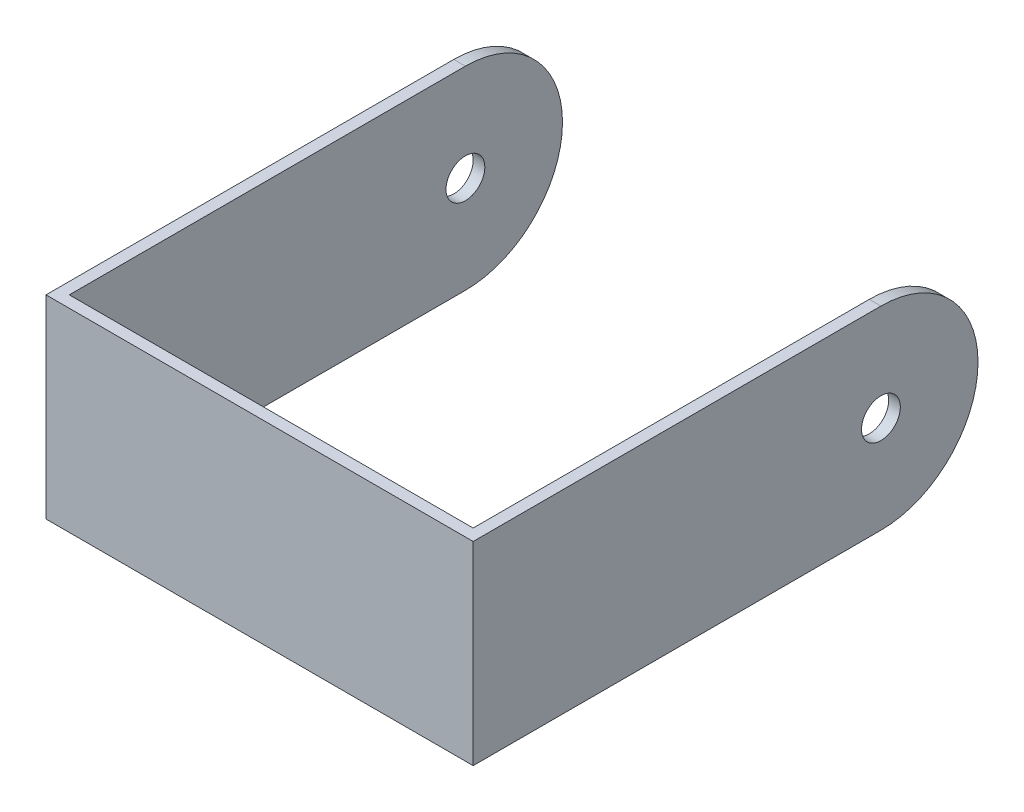
ISO-10303-21;
HEADER;
FILE_DESCRIPTION(('STEP AP214'),'2;1');
FILE_NAME('part.step','',(''),(''),'','','');
FILE_SCHEMA(('AUTOMOTIVE_DESIGN { 1 0 10303 214 1 1 1 1 }'));
ENDSEC;
DATA;
#1=APPLICATION_CONTEXT('core data for automotive mechanical design processes');
#2=APPLICATION_PROTOCOL_DEFINITION('international standard','automotive_design',2000,#1);
#3=PRODUCT_CONTEXT('',#1,'mechanical');
#4=PRODUCT('Part','Part','',(#3));
#5=PRODUCT_RELATED_PRODUCT_CATEGORY('part','',(#4));
#6=PRODUCT_DEFINITION_FORMATION('','',#4);
#7=PRODUCT_DEFINITION_CONTEXT('part definition',#1,'design');
#8=PRODUCT_DEFINITION('design','',#6,#7);
#9=PRODUCT_DEFINITION_SHAPE('','',#8);
#10=(LENGTH_UNIT() NAMED_UNIT(*) SI_UNIT(.MILLI.,.METRE.));
#11=(NAMED_UNIT(*) PLANE_ANGLE_UNIT() SI_UNIT($,.RADIAN.));
#12=(NAMED_UNIT(*) SI_UNIT($,.STERADIAN.) SOLID_ANGLE_UNIT());
#13=UNCERTAINTY_MEASURE_WITH_UNIT(LENGTH_MEASURE(1.E-05),#10,'distance_accuracy_value','');
#14=(GEOMETRIC_REPRESENTATION_CONTEXT(3) GLOBAL_UNCERTAINTY_ASSIGNED_CONTEXT((#13)) GLOBAL_UNIT_ASSIGNED_CONTEXT((#10,
#11,#12)) REPRESENTATION_CONTEXT('',''));
#15=CARTESIAN_POINT('',(0.,0.,0.));
#16=DIRECTION('',(0.,0.,1.));
#17=DIRECTION('',(1.,0.,0.));
#18=AXIS2_PLACEMENT_3D('',#15,#16,#17);
#19=CARTESIAN_POINT('',(-27.5,12.5,32.5));
#20=DIRECTION('',(1.,0.,0.));
#21=DIRECTION('',(0.,0.,-1.));
#22=AXIS2_PLACEMENT_3D('',#19,#20,#21);
#23=PLANE('',#22);
#24=CARTESIAN_POINT('',(-27.5,0.,-20.));
#25=DIRECTION('',(1.,0.,0.));
#26=DIRECTION('',(0.,0.,-1.));
#27=AXIS2_PLACEMENT_3D('',#24,#25,#26);
#28=CIRCLE('',#27,2.5);
#29=CARTESIAN_POINT('',(-27.5,0.,-22.5));
#30=VERTEX_POINT('',#29);
#31=EDGE_CURVE('E196',#30,#30,#28,.T.);
#32=ORIENTED_EDGE('',*,*,#31,.T.);
#33=EDGE_LOOP('',(#32));
#34=FACE_BOUND('',#33,.T.);
#35=CARTESIAN_POINT('',(-27.5,0.,-20.));
#36=DIRECTION('',(1.,0.,0.));
#37=DIRECTION('',(0.,0.,-1.));
#38=AXIS2_PLACEMENT_3D('',#35,#36,#37);
#39=CIRCLE('',#38,12.5);
#40=CARTESIAN_POINT('',(-27.5,12.5,-20.));
#41=VERTEX_POINT('',#40);
#42=CARTESIAN_POINT('',(-27.5,0.,-32.5));
#43=VERTEX_POINT('',#42);
#44=EDGE_CURVE('E130',#41,#43,#39,.F.);
#45=ORIENTED_EDGE('',*,*,#44,.T.);
#46=CARTESIAN_POINT('',(-27.5,0.,-20.));
#47=DIRECTION('',(1.,0.,0.));
#48=DIRECTION('',(0.,0.,-1.));
#49=AXIS2_PLACEMENT_3D('',#46,#47,#48);
#50=CIRCLE('',#49,12.5);
#51=CARTESIAN_POINT('',(-27.5,-12.5,-20.));
#52=VERTEX_POINT('',#51);
#53=EDGE_CURVE('E167',#43,#52,#50,.F.);
#54=ORIENTED_EDGE('',*,*,#53,.T.);
#55=DIRECTION('',(0.,0.,1.));
#56=VECTOR('',#55,1.);
#57=CARTESIAN_POINT('',(-27.5,-12.5,32.5));
#58=LINE('',#57,#56);
#59=CARTESIAN_POINT('',(-27.5,-12.5,32.5));
#60=VERTEX_POINT('',#59);
#61=EDGE_CURVE('E127',#52,#60,#58,.T.);
#62=ORIENTED_EDGE('',*,*,#61,.T.);
#63=DIRECTION('',(0.,-1.,0.));
#64=VECTOR('',#63,1.);
#65=CARTESIAN_POINT('',(-27.5,12.5,32.5));
#66=LINE('',#65,#64);
#67=CARTESIAN_POINT('',(-27.5,12.5,32.5));
#68=VERTEX_POINT('',#67);
#69=EDGE_CURVE('E125',#68,#60,#66,.T.);
#70=ORIENTED_EDGE('',*,*,#69,.F.);
#71=DIRECTION('',(0.,0.,1.));
#72=VECTOR('',#71,1.);
#73=CARTESIAN_POINT('',(-27.5,12.5,32.5));
#74=LINE('',#73,#72);
#75=EDGE_CURVE('E110',#41,#68,#74,.T.);
#76=ORIENTED_EDGE('',*,*,#75,.F.);
#77=EDGE_LOOP('',(#45,#54,#62,#70,#76));
#78=FACE_BOUND('',#77,.T.);
#79=ADVANCED_FACE('F33',(#34,#78),#23,.F.);
#80=CARTESIAN_POINT('',(27.5,12.5,32.5));
#81=DIRECTION('',(0.,0.,-1.));
#82=DIRECTION('',(-1.,0.,0.));
#83=AXIS2_PLACEMENT_3D('',#80,#81,#82);
#84=PLANE('',#83);
#85=DIRECTION('',(1.,0.,0.));
#86=VECTOR('',#85,1.);
#87=CARTESIAN_POINT('',(27.5,-12.5,32.5));
#88=LINE('',#87,#86);
#89=CARTESIAN_POINT('',(27.5,-12.5,32.5));
#90=VERTEX_POINT('',#89);
#91=EDGE_CURVE('E149',#60,#90,#88,.T.);
#92=ORIENTED_EDGE('',*,*,#91,.T.);
#93=DIRECTION('',(0.,-1.,0.));
#94=VECTOR('',#93,1.);
#95=CARTESIAN_POINT('',(27.5,12.5,32.5));
#96=LINE('',#95,#94);
#97=CARTESIAN_POINT('',(27.5,12.5,32.5));
#98=VERTEX_POINT('',#97);
#99=EDGE_CURVE('E131',#98,#90,#96,.T.);
#100=ORIENTED_EDGE('',*,*,#99,.F.);
#101=DIRECTION('',(1.,0.,0.));
#102=VECTOR('',#101,1.);
#103=CARTESIAN_POINT('',(27.5,12.5,32.5));
#104=LINE('',#103,#102);
#105=EDGE_CURVE('E116',#68,#98,#104,.T.);
#106=ORIENTED_EDGE('',*,*,#105,.F.);
#107=ORIENTED_EDGE('',*,*,#69,.T.);
#108=EDGE_LOOP('',(#92,#100,#106,#107));
#109=FACE_BOUND('',#108,.T.);
#110=ADVANCED_FACE('F133',(#109),#84,.F.);
#111=CARTESIAN_POINT('',(27.5,12.5,32.5));
#112=DIRECTION('',(-1.,0.,0.));
#113=DIRECTION('',(0.,0.,1.));
#114=AXIS2_PLACEMENT_3D('',#111,#112,#113);
#115=PLANE('',#114);
#116=CARTESIAN_POINT('',(27.5,0.,-20.));
#117=DIRECTION('',(1.,0.,0.));
#118=DIRECTION('',(0.,0.,-1.));
#119=AXIS2_PLACEMENT_3D('',#116,#117,#118);
#120=CIRCLE('',#119,2.5);
#121=CARTESIAN_POINT('',(27.5,0.,-22.5));
#122=VERTEX_POINT('',#121);
#123=EDGE_CURVE('E200',#122,#122,#120,.T.);
#124=ORIENTED_EDGE('',*,*,#123,.F.);
#125=EDGE_LOOP('',(#124));
#126=FACE_BOUND('',#125,.T.);
#127=DIRECTION('',(0.,0.,-1.));
#128=VECTOR('',#127,1.);
#129=CARTESIAN_POINT('',(27.5,-12.5,32.5));
#130=LINE('',#129,#128);
#131=CARTESIAN_POINT('',(27.5,-12.5,-20.));
#132=VERTEX_POINT('',#131);
#133=EDGE_CURVE('E152',#90,#132,#130,.T.);
#134=ORIENTED_EDGE('',*,*,#133,.T.);
#135=CARTESIAN_POINT('',(27.5,0.,-20.));
#136=DIRECTION('',(-1.,0.,0.));
#137=DIRECTION('',(0.,0.,1.));
#138=AXIS2_PLACEMENT_3D('',#135,#136,#137);
#139=CIRCLE('',#138,12.5);
#140=CARTESIAN_POINT('',(27.5,0.,-32.5));
#141=VERTEX_POINT('',#140);
#142=EDGE_CURVE('E11',#132,#141,#139,.F.);
#143=ORIENTED_EDGE('',*,*,#142,.T.);
#144=CARTESIAN_POINT('',(27.5,0.,-20.));
#145=DIRECTION('',(-1.,0.,0.));
#146=DIRECTION('',(0.,0.,1.));
#147=AXIS2_PLACEMENT_3D('',#144,#145,#146);
#148=CIRCLE('',#147,12.5);
#149=CARTESIAN_POINT('',(27.5,12.5,-20.));
#150=VERTEX_POINT('',#149);
#151=EDGE_CURVE('E42',#141,#150,#148,.F.);
#152=ORIENTED_EDGE('',*,*,#151,.T.);
#153=DIRECTION('',(0.,0.,-1.));
#154=VECTOR('',#153,1.);
#155=CARTESIAN_POINT('',(27.5,12.5,32.5));
#156=LINE('',#155,#154);
#157=EDGE_CURVE('E136',#98,#150,#156,.T.);
#158=ORIENTED_EDGE('',*,*,#157,.F.);
#159=ORIENTED_EDGE('',*,*,#99,.T.);
#160=EDGE_LOOP('',(#134,#143,#152,#158,#159));
#161=FACE_BOUND('',#160,.T.);
#162=ADVANCED_FACE('F207',(#126,#161),#115,.F.);
#163=CARTESIAN_POINT('',(26.,12.5,31.));
#164=DIRECTION('',(1.,0.,0.));
#165=DIRECTION('',(0.,0.,-1.));
#166=AXIS2_PLACEMENT_3D('',#163,#164,#165);
#167=PLANE('',#166);
#168=CARTESIAN_POINT('',(26.,0.,-20.));
#169=DIRECTION('',(1.,0.,0.));
#170=DIRECTION('',(0.,0.,-1.));
#171=AXIS2_PLACEMENT_3D('',#168,#169,#170);
#172=CIRCLE('',#171,2.5);
#173=CARTESIAN_POINT('',(26.,0.,-22.5));
#174=VERTEX_POINT('',#173);
#175=EDGE_CURVE('E189',#174,#174,#172,.T.);
#176=ORIENTED_EDGE('',*,*,#175,.T.);
#177=EDGE_LOOP('',(#176));
#178=FACE_BOUND('',#177,.T.);
#179=CARTESIAN_POINT('',(26.,0.,-20.));
#180=DIRECTION('',(1.,0.,0.));
#181=DIRECTION('',(0.,0.,-1.));
#182=AXIS2_PLACEMENT_3D('',#179,#180,#181);
#183=CIRCLE('',#182,12.5);
#184=CARTESIAN_POINT('',(26.,12.5,-20.));
#185=VERTEX_POINT('',#184);
#186=CARTESIAN_POINT('',(26.,0.,-32.5));
#187=VERTEX_POINT('',#186);
#188=EDGE_CURVE('E56',#185,#187,#183,.F.);
#189=ORIENTED_EDGE('',*,*,#188,.T.);
#190=CARTESIAN_POINT('',(26.,0.,-20.));
#191=DIRECTION('',(1.,0.,0.));
#192=DIRECTION('',(0.,0.,-1.));
#193=AXIS2_PLACEMENT_3D('',#190,#191,#192);
#194=CIRCLE('',#193,12.5);
#195=CARTESIAN_POINT('',(26.,-12.5,-20.));
#196=VERTEX_POINT('',#195);
#197=EDGE_CURVE('E183',#187,#196,#194,.F.);
#198=ORIENTED_EDGE('',*,*,#197,.T.);
#199=DIRECTION('',(0.,0.,1.));
#200=VECTOR('',#199,1.);
#201=CARTESIAN_POINT('',(26.,-12.5,31.));
#202=LINE('',#201,#200);
#203=CARTESIAN_POINT('',(26.,-12.5,31.));
#204=VERTEX_POINT('',#203);
#205=EDGE_CURVE('E154',#196,#204,#202,.T.);
#206=ORIENTED_EDGE('',*,*,#205,.T.);
#207=DIRECTION('',(0.,-1.,0.));
#208=VECTOR('',#207,1.);
#209=CARTESIAN_POINT('',(26.,12.5,31.));
#210=LINE('',#209,#208);
#211=CARTESIAN_POINT('',(26.,12.5,31.));
#212=VERTEX_POINT('',#211);
#213=EDGE_CURVE('E162',#212,#204,#210,.T.);
#214=ORIENTED_EDGE('',*,*,#213,.F.);
#215=DIRECTION('',(0.,0.,1.));
#216=VECTOR('',#215,1.);
#217=CARTESIAN_POINT('',(26.,12.5,31.));
#218=LINE('',#217,#216);
#219=EDGE_CURVE('E138',#185,#212,#218,.T.);
#220=ORIENTED_EDGE('',*,*,#219,.F.);
#221=EDGE_LOOP('',(#189,#198,#206,#214,#220));
#222=FACE_BOUND('',#221,.T.);
#223=ADVANCED_FACE('F209',(#178,#222),#167,.F.);
#224=CARTESIAN_POINT('',(26.,12.5,31.));
#225=DIRECTION('',(0.,0.,1.));
#226=DIRECTION('',(1.,0.,0.));
#227=AXIS2_PLACEMENT_3D('',#224,#225,#226);
#228=PLANE('',#227);
#229=DIRECTION('',(-1.,0.,0.));
#230=VECTOR('',#229,1.);
#231=CARTESIAN_POINT('',(26.,-12.5,31.));
#232=LINE('',#231,#230);
#233=CARTESIAN_POINT('',(-26.,-12.5,31.));
#234=VERTEX_POINT('',#233);
#235=EDGE_CURVE('E156',#204,#234,#232,.T.);
#236=ORIENTED_EDGE('',*,*,#235,.T.);
#237=DIRECTION('',(0.,-1.,0.));
#238=VECTOR('',#237,1.);
#239=CARTESIAN_POINT('',(-26.,12.5,31.));
#240=LINE('',#239,#238);
#241=CARTESIAN_POINT('',(-26.,12.5,31.));
#242=VERTEX_POINT('',#241);
#243=EDGE_CURVE('E147',#242,#234,#240,.T.);
#244=ORIENTED_EDGE('',*,*,#243,.F.);
#245=DIRECTION('',(-1.,0.,0.));
#246=VECTOR('',#245,1.);
#247=CARTESIAN_POINT('',(26.,12.5,31.));
#248=LINE('',#247,#246);
#249=EDGE_CURVE('E143',#212,#242,#248,.T.);
#250=ORIENTED_EDGE('',*,*,#249,.F.);
#251=ORIENTED_EDGE('',*,*,#213,.T.);
#252=EDGE_LOOP('',(#236,#244,#250,#251));
#253=FACE_BOUND('',#252,.T.);
#254=ADVANCED_FACE('F221',(#253),#228,.F.);
#255=CARTESIAN_POINT('',(-26.,12.5,31.));
#256=DIRECTION('',(-1.,0.,0.));
#257=DIRECTION('',(0.,0.,1.));
#258=AXIS2_PLACEMENT_3D('',#255,#256,#257);
#259=PLANE('',#258);
#260=CARTESIAN_POINT('',(-26.,0.,-20.));
#261=DIRECTION('',(-1.,0.,0.));
#262=DIRECTION('',(0.,0.,1.));
#263=AXIS2_PLACEMENT_3D('',#260,#261,#262);
#264=CIRCLE('',#263,2.5);
#265=CARTESIAN_POINT('',(-26.,0.,-17.5));
#266=VERTEX_POINT('',#265);
#267=EDGE_CURVE('E37',#266,#266,#264,.T.);
#268=ORIENTED_EDGE('',*,*,#267,.T.);
#269=EDGE_LOOP('',(#268));
#270=FACE_BOUND('',#269,.T.);
#271=DIRECTION('',(0.,0.,-1.));
#272=VECTOR('',#271,1.);
#273=CARTESIAN_POINT('',(-26.,-12.5,31.));
#274=LINE('',#273,#272);
#275=CARTESIAN_POINT('',(-26.,-12.5,-20.));
#276=VERTEX_POINT('',#275);
#277=EDGE_CURVE('E122',#234,#276,#274,.T.);
#278=ORIENTED_EDGE('',*,*,#277,.T.);
#279=CARTESIAN_POINT('',(-26.,0.,-20.));
#280=DIRECTION('',(-1.,0.,0.));
#281=DIRECTION('',(0.,0.,1.));
#282=AXIS2_PLACEMENT_3D('',#279,#280,#281);
#283=CIRCLE('',#282,12.5);
#284=CARTESIAN_POINT('',(-26.,0.,-32.5));
#285=VERTEX_POINT('',#284);
#286=EDGE_CURVE('E177',#276,#285,#283,.F.);
#287=ORIENTED_EDGE('',*,*,#286,.T.);
#288=CARTESIAN_POINT('',(-26.,0.,-20.));
#289=DIRECTION('',(-1.,0.,0.));
#290=DIRECTION('',(0.,0.,1.));
#291=AXIS2_PLACEMENT_3D('',#288,#289,#290);
#292=CIRCLE('',#291,12.5);
#293=CARTESIAN_POINT('',(-26.,12.5,-20.));
#294=VERTEX_POINT('',#293);
#295=EDGE_CURVE('E175',#285,#294,#292,.F.);
#296=ORIENTED_EDGE('',*,*,#295,.T.);
#297=DIRECTION('',(0.,0.,-1.));
#298=VECTOR('',#297,1.);
#299=CARTESIAN_POINT('',(-26.,12.5,31.));
#300=LINE('',#299,#298);
#301=EDGE_CURVE('E145',#242,#294,#300,.T.);
#302=ORIENTED_EDGE('',*,*,#301,.F.);
#303=ORIENTED_EDGE('',*,*,#243,.T.);
#304=EDGE_LOOP('',(#278,#287,#296,#302,#303));
#305=FACE_BOUND('',#304,.T.);
#306=ADVANCED_FACE('F226',(#270,#305),#259,.F.);
#307=CARTESIAN_POINT('',(0.,12.5,0.));
#308=DIRECTION('',(0.,1.,0.));
#309=DIRECTION('',(0.,0.,1.));
#310=AXIS2_PLACEMENT_3D('',#307,#308,#309);
#311=PLANE('',#310);
#312=ORIENTED_EDGE('',*,*,#301,.T.);
#313=DIRECTION('',(-1.,0.,0.));
#314=VECTOR('',#313,1.);
#315=CARTESIAN_POINT('',(-27.5,12.5,-20.));
#316=LINE('',#315,#314);
#317=EDGE_CURVE('E119',#294,#41,#316,.T.);
#318=ORIENTED_EDGE('',*,*,#317,.T.);
#319=ORIENTED_EDGE('',*,*,#75,.T.);
#320=ORIENTED_EDGE('',*,*,#105,.T.);
#321=ORIENTED_EDGE('',*,*,#157,.T.);
#322=DIRECTION('',(-1.,0.,0.));
#323=VECTOR('',#322,1.);
#324=CARTESIAN_POINT('',(26.,12.5,-20.));
#325=LINE('',#324,#323);
#326=EDGE_CURVE('E179',#150,#185,#325,.T.);
#327=ORIENTED_EDGE('',*,*,#326,.T.);
#328=ORIENTED_EDGE('',*,*,#219,.T.);
#329=ORIENTED_EDGE('',*,*,#249,.T.);
#330=EDGE_LOOP('',(#312,#318,#319,#320,#321,#327,#328,#329));
#331=FACE_BOUND('',#330,.T.);
#332=ADVANCED_FACE('F113',(#331),#311,.T.);
#333=CARTESIAN_POINT('',(0.,-12.5,0.));
#334=DIRECTION('',(0.,1.,0.));
#335=DIRECTION('',(0.,0.,1.));
#336=AXIS2_PLACEMENT_3D('',#333,#334,#335);
#337=PLANE('',#336);
#338=ORIENTED_EDGE('',*,*,#61,.F.);
#339=DIRECTION('',(-1.,0.,0.));
#340=VECTOR('',#339,1.);
#341=CARTESIAN_POINT('',(0.,-12.5,-20.));
#342=LINE('',#341,#340);
#343=EDGE_CURVE('E172',#52,#276,#342,.F.);
#344=ORIENTED_EDGE('',*,*,#343,.T.);
#345=ORIENTED_EDGE('',*,*,#277,.F.);
#346=ORIENTED_EDGE('',*,*,#235,.F.);
#347=ORIENTED_EDGE('',*,*,#205,.F.);
#348=DIRECTION('',(-1.,0.,0.));
#349=VECTOR('',#348,1.);
#350=CARTESIAN_POINT('',(0.,-12.5,-20.));
#351=LINE('',#350,#349);
#352=EDGE_CURVE('E169',#196,#132,#351,.F.);
#353=ORIENTED_EDGE('',*,*,#352,.T.);
#354=ORIENTED_EDGE('',*,*,#133,.F.);
#355=ORIENTED_EDGE('',*,*,#91,.F.);
#356=EDGE_LOOP('',(#338,#344,#345,#346,#347,#353,#354,#355));
#357=FACE_BOUND('',#356,.T.);
#358=ADVANCED_FACE('F213',(#357),#337,.F.);
#359=CARTESIAN_POINT('',(0.,0.,-20.));
#360=DIRECTION('',(1.,0.,0.));
#361=DIRECTION('',(0.,0.,-1.));
#362=AXIS2_PLACEMENT_3D('',#359,#360,#361);
#363=CYLINDRICAL_SURFACE('',#362,12.5);
#364=ORIENTED_EDGE('',*,*,#317,.F.);
#365=ORIENTED_EDGE('',*,*,#295,.F.);
#366=DIRECTION('',(-1.,0.,0.));
#367=VECTOR('',#366,1.);
#368=CARTESIAN_POINT('',(-26.,0.,-32.5));
#369=LINE('',#368,#367);
#370=EDGE_CURVE('E150',#43,#285,#369,.F.);
#371=ORIENTED_EDGE('',*,*,#370,.F.);
#372=ORIENTED_EDGE('',*,*,#44,.F.);
#373=EDGE_LOOP('',(#364,#365,#371,#372));
#374=FACE_BOUND('',#373,.T.);
#375=ADVANCED_FACE('F230',(#374),#363,.T.);
#376=CARTESIAN_POINT('',(-27.5,0.,-20.));
#377=DIRECTION('',(-1.,0.,0.));
#378=DIRECTION('',(0.,0.,1.));
#379=AXIS2_PLACEMENT_3D('',#376,#377,#378);
#380=CYLINDRICAL_SURFACE('',#379,12.5);
#381=ORIENTED_EDGE('',*,*,#286,.F.);
#382=ORIENTED_EDGE('',*,*,#343,.F.);
#383=ORIENTED_EDGE('',*,*,#53,.F.);
#384=ORIENTED_EDGE('',*,*,#370,.T.);
#385=EDGE_LOOP('',(#381,#382,#383,#384));
#386=FACE_BOUND('',#385,.T.);
#387=ADVANCED_FACE('F234',(#386),#380,.T.);
#388=CARTESIAN_POINT('',(0.,0.,-20.));
#389=DIRECTION('',(1.,0.,0.));
#390=DIRECTION('',(0.,0.,-1.));
#391=AXIS2_PLACEMENT_3D('',#388,#389,#390);
#392=CYLINDRICAL_SURFACE('',#391,12.5);
#393=ORIENTED_EDGE('',*,*,#326,.F.);
#394=ORIENTED_EDGE('',*,*,#151,.F.);
#395=DIRECTION('',(-1.,0.,0.));
#396=VECTOR('',#395,1.);
#397=CARTESIAN_POINT('',(27.5,0.,-32.5));
#398=LINE('',#397,#396);
#399=EDGE_CURVE('E187',#187,#141,#398,.F.);
#400=ORIENTED_EDGE('',*,*,#399,.F.);
#401=ORIENTED_EDGE('',*,*,#188,.F.);
#402=EDGE_LOOP('',(#393,#394,#400,#401));
#403=FACE_BOUND('',#402,.T.);
#404=ADVANCED_FACE('F35',(#403),#392,.T.);
#405=CARTESIAN_POINT('',(26.,0.,-20.));
#406=DIRECTION('',(-1.,0.,0.));
#407=DIRECTION('',(0.,0.,1.));
#408=AXIS2_PLACEMENT_3D('',#405,#406,#407);
#409=CYLINDRICAL_SURFACE('',#408,12.5);
#410=ORIENTED_EDGE('',*,*,#142,.F.);
#411=ORIENTED_EDGE('',*,*,#352,.F.);
#412=ORIENTED_EDGE('',*,*,#197,.F.);
#413=ORIENTED_EDGE('',*,*,#399,.T.);
#414=EDGE_LOOP('',(#410,#411,#412,#413));
#415=FACE_BOUND('',#414,.T.);
#416=ADVANCED_FACE('F217',(#415),#409,.T.);
#417=CARTESIAN_POINT('',(-27.5,0.,-20.));
#418=DIRECTION('',(1.,0.,0.));
#419=DIRECTION('',(0.,0.,-1.));
#420=AXIS2_PLACEMENT_3D('',#417,#418,#419);
#421=CYLINDRICAL_SURFACE('',#420,2.5);
#422=ORIENTED_EDGE('',*,*,#31,.F.);
#423=EDGE_LOOP('',(#422));
#424=FACE_BOUND('',#423,.T.);
#425=ORIENTED_EDGE('',*,*,#267,.F.);
#426=EDGE_LOOP('',(#425));
#427=FACE_BOUND('',#426,.T.);
#428=ADVANCED_FACE('F263',(#424,#427),#421,.F.);
#429=ORIENTED_EDGE('',*,*,#123,.T.);
#430=EDGE_LOOP('',(#429));
#431=FACE_BOUND('',#430,.T.);
#432=ORIENTED_EDGE('',*,*,#175,.F.);
#433=EDGE_LOOP('',(#432));
#434=FACE_BOUND('',#433,.T.);
#435=ADVANCED_FACE('F204',(#431,#434),#421,.F.);
#436=CLOSED_SHELL('',(#79,#110,#162,#223,#254,#306,#332,#358,#375,#387,#404,#416,#428,#435));
#437=MANIFOLD_SOLID_BREP('B2',#436);
#438=ADVANCED_BREP_SHAPE_REPRESENTATION('',(#18,#437),#14);
#439=SHAPE_DEFINITION_REPRESENTATION(#9,#438);
ENDSEC;
END-ISO-10303-21;
